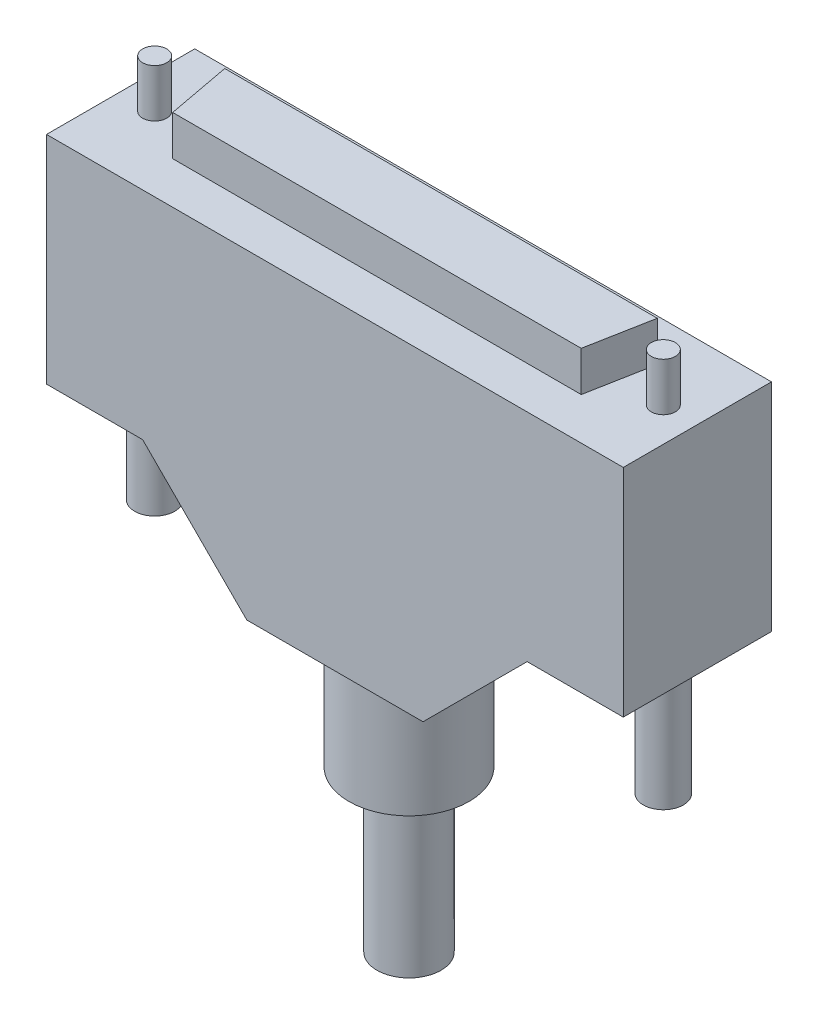
ISO-10303-21;
HEADER;
FILE_DESCRIPTION(('STEP AP214'),'2;1');
FILE_NAME('part.step','',(''),(''),'','','');
FILE_SCHEMA(('AUTOMOTIVE_DESIGN { 1 0 10303 214 1 1 1 1 }'));
ENDSEC;
DATA;
#1=APPLICATION_CONTEXT('core data for automotive mechanical design processes');
#2=APPLICATION_PROTOCOL_DEFINITION('international standard','automotive_design',2000,#1);
#3=PRODUCT_CONTEXT('',#1,'mechanical');
#4=PRODUCT('Part','Part','',(#3));
#5=PRODUCT_RELATED_PRODUCT_CATEGORY('part','',(#4));
#6=PRODUCT_DEFINITION_FORMATION('','',#4);
#7=PRODUCT_DEFINITION_CONTEXT('part definition',#1,'design');
#8=PRODUCT_DEFINITION('design','',#6,#7);
#9=PRODUCT_DEFINITION_SHAPE('','',#8);
#10=(LENGTH_UNIT() NAMED_UNIT(*) SI_UNIT(.MILLI.,.METRE.));
#11=(NAMED_UNIT(*) PLANE_ANGLE_UNIT() SI_UNIT($,.RADIAN.));
#12=(NAMED_UNIT(*) SI_UNIT($,.STERADIAN.) SOLID_ANGLE_UNIT());
#13=UNCERTAINTY_MEASURE_WITH_UNIT(LENGTH_MEASURE(1.E-05),#10,'distance_accuracy_value','');
#14=(GEOMETRIC_REPRESENTATION_CONTEXT(3) GLOBAL_UNCERTAINTY_ASSIGNED_CONTEXT((#13)) GLOBAL_UNIT_ASSIGNED_CONTEXT((#10,
#11,#12)) REPRESENTATION_CONTEXT('',''));
#15=CARTESIAN_POINT('',(0.,0.,0.));
#16=DIRECTION('',(0.,0.,1.));
#17=DIRECTION('',(1.,0.,0.));
#18=AXIS2_PLACEMENT_3D('',#15,#16,#17);
#19=CARTESIAN_POINT('',(36.,0.,9.25));
#20=DIRECTION('',(0.,-1.,0.));
#21=DIRECTION('',(1.,0.,0.));
#22=AXIS2_PLACEMENT_3D('',#19,#20,#21);
#23=PLANE('',#22);
#24=CARTESIAN_POINT('',(-31.75,0.,0.));
#25=DIRECTION('',(0.,-1.,0.));
#26=DIRECTION('',(1.,0.,0.));
#27=AXIS2_PLACEMENT_3D('',#24,#25,#26);
#28=CIRCLE('',#27,1.5);
#29=CARTESIAN_POINT('',(-30.25,0.,0.));
#30=VERTEX_POINT('',#29);
#31=EDGE_CURVE('E40',#30,#30,#28,.F.);
#32=ORIENTED_EDGE('',*,*,#31,.F.);
#33=EDGE_LOOP('',(#32));
#34=FACE_BOUND('',#33,.T.);
#35=DIRECTION('',(-1.,0.,0.));
#36=VECTOR('',#35,1.);
#37=CARTESIAN_POINT('',(36.,0.,-9.25));
#38=LINE('',#37,#36);
#39=CARTESIAN_POINT('',(36.,0.,-9.25));
#40=VERTEX_POINT('',#39);
#41=CARTESIAN_POINT('',(-36.,0.,-9.25));
#42=VERTEX_POINT('',#41);
#43=EDGE_CURVE('E167',#40,#42,#38,.T.);
#44=ORIENTED_EDGE('',*,*,#43,.T.);
#45=DIRECTION('',(0.,0.,-1.));
#46=VECTOR('',#45,1.);
#47=CARTESIAN_POINT('',(-36.,0.,9.25));
#48=LINE('',#47,#46);
#49=CARTESIAN_POINT('',(-36.,0.,9.25));
#50=VERTEX_POINT('',#49);
#51=EDGE_CURVE('E181',#50,#42,#48,.T.);
#52=ORIENTED_EDGE('',*,*,#51,.F.);
#53=DIRECTION('',(-1.,0.,0.));
#54=VECTOR('',#53,1.);
#55=CARTESIAN_POINT('',(36.,0.,9.25));
#56=LINE('',#55,#54);
#57=CARTESIAN_POINT('',(36.,0.,9.25));
#58=VERTEX_POINT('',#57);
#59=EDGE_CURVE('E179',#58,#50,#56,.T.);
#60=ORIENTED_EDGE('',*,*,#59,.F.);
#61=DIRECTION('',(0.,0.,-1.));
#62=VECTOR('',#61,1.);
#63=CARTESIAN_POINT('',(36.,0.,9.25));
#64=LINE('',#63,#62);
#65=EDGE_CURVE('E199',#58,#40,#64,.T.);
#66=ORIENTED_EDGE('',*,*,#65,.T.);
#67=EDGE_LOOP('',(#44,#52,#60,#66));
#68=FACE_BOUND('',#67,.T.);
#69=DIRECTION('',(0.184288535050185,0.,0.982872186934322));
#70=VECTOR('',#69,1.);
#71=CARTESIAN_POINT('',(-25.5,0.,4.00000000000001));
#72=LINE('',#71,#70);
#73=CARTESIAN_POINT('',(-27.,0.,-4.00000000000001));
#74=VERTEX_POINT('',#73);
#75=CARTESIAN_POINT('',(-25.5,0.,4.00000000000001));
#76=VERTEX_POINT('',#75);
#77=EDGE_CURVE('E141',#74,#76,#72,.T.);
#78=ORIENTED_EDGE('',*,*,#77,.F.);
#79=DIRECTION('',(-1.,0.,0.));
#80=VECTOR('',#79,1.);
#81=CARTESIAN_POINT('',(-27.,0.,-4.00000000000001));
#82=LINE('',#81,#80);
#83=CARTESIAN_POINT('',(27.,0.,-4.00000000000001));
#84=VERTEX_POINT('',#83);
#85=EDGE_CURVE('E138',#84,#74,#82,.T.);
#86=ORIENTED_EDGE('',*,*,#85,.F.);
#87=DIRECTION('',(0.184288535050185,0.,-0.982872186934322));
#88=VECTOR('',#87,1.);
#89=CARTESIAN_POINT('',(27.,0.,-4.00000000000001));
#90=LINE('',#89,#88);
#91=CARTESIAN_POINT('',(25.5,0.,4.00000000000001));
#92=VERTEX_POINT('',#91);
#93=EDGE_CURVE('E52',#92,#84,#90,.T.);
#94=ORIENTED_EDGE('',*,*,#93,.F.);
#95=DIRECTION('',(1.,0.,0.));
#96=VECTOR('',#95,1.);
#97=CARTESIAN_POINT('',(25.5,0.,4.00000000000001));
#98=LINE('',#97,#96);
#99=EDGE_CURVE('E47',#76,#92,#98,.T.);
#100=ORIENTED_EDGE('',*,*,#99,.F.);
#101=EDGE_LOOP('',(#78,#86,#94,#100));
#102=FACE_BOUND('',#101,.T.);
#103=CARTESIAN_POINT('',(31.75,0.,0.));
#104=DIRECTION('',(0.,-1.,0.));
#105=DIRECTION('',(1.,0.,0.));
#106=AXIS2_PLACEMENT_3D('',#103,#104,#105);
#107=CIRCLE('',#106,1.5);
#108=CARTESIAN_POINT('',(33.25,0.,0.));
#109=VERTEX_POINT('',#108);
#110=EDGE_CURVE('E11',#109,#109,#107,.F.);
#111=ORIENTED_EDGE('',*,*,#110,.F.);
#112=EDGE_LOOP('',(#111));
#113=FACE_BOUND('',#112,.T.);
#114=ADVANCED_FACE('F32',(#34,#68,#102,#113),#23,.F.);
#115=CARTESIAN_POINT('',(36.,-27.,9.25));
#116=DIRECTION('',(0.,1.,0.));
#117=DIRECTION('',(-1.,0.,0.));
#118=AXIS2_PLACEMENT_3D('',#115,#116,#117);
#119=PLANE('',#118);
#120=DIRECTION('',(1.,0.,0.));
#121=VECTOR('',#120,1.);
#122=CARTESIAN_POINT('',(36.,-27.,-9.25));
#123=LINE('',#122,#121);
#124=CARTESIAN_POINT('',(24.,-27.,-9.25));
#125=VERTEX_POINT('',#124);
#126=CARTESIAN_POINT('',(36.,-27.,-9.25));
#127=VERTEX_POINT('',#126);
#128=EDGE_CURVE('E192',#125,#127,#123,.T.);
#129=ORIENTED_EDGE('',*,*,#128,.T.);
#130=DIRECTION('',(0.,0.,-1.));
#131=VECTOR('',#130,1.);
#132=CARTESIAN_POINT('',(36.,-27.,9.25));
#133=LINE('',#132,#131);
#134=CARTESIAN_POINT('',(36.,-27.,9.25));
#135=VERTEX_POINT('',#134);
#136=EDGE_CURVE('E202',#135,#127,#133,.T.);
#137=ORIENTED_EDGE('',*,*,#136,.F.);
#138=DIRECTION('',(1.,0.,0.));
#139=VECTOR('',#138,1.);
#140=CARTESIAN_POINT('',(36.,-27.,9.25));
#141=LINE('',#140,#139);
#142=CARTESIAN_POINT('',(24.,-27.,9.25));
#143=VERTEX_POINT('',#142);
#144=EDGE_CURVE('E175',#143,#135,#141,.T.);
#145=ORIENTED_EDGE('',*,*,#144,.F.);
#146=DIRECTION('',(0.,0.,-1.));
#147=VECTOR('',#146,1.);
#148=CARTESIAN_POINT('',(24.,-27.,9.25));
#149=LINE('',#148,#147);
#150=EDGE_CURVE('E205',#143,#125,#149,.T.);
#151=ORIENTED_EDGE('',*,*,#150,.T.);
#152=EDGE_LOOP('',(#129,#137,#145,#151));
#153=FACE_BOUND('',#152,.T.);
#154=CARTESIAN_POINT('',(31.75,-27.,0.));
#155=DIRECTION('',(0.,1.,0.));
#156=DIRECTION('',(-1.,0.,0.));
#157=AXIS2_PLACEMENT_3D('',#154,#155,#156);
#158=CIRCLE('',#157,2.5);
#159=CARTESIAN_POINT('',(29.25,-27.,0.));
#160=VERTEX_POINT('',#159);
#161=EDGE_CURVE('E226',#160,#160,#158,.F.);
#162=ORIENTED_EDGE('',*,*,#161,.F.);
#163=EDGE_LOOP('',(#162));
#164=FACE_BOUND('',#163,.T.);
#165=ADVANCED_FACE('F235',(#153,#164),#119,.F.);
#166=CARTESIAN_POINT('',(-36.,-27.,9.25));
#167=DIRECTION('',(0.,1.,0.));
#168=DIRECTION('',(0.,0.,1.));
#169=AXIS2_PLACEMENT_3D('',#166,#167,#168);
#170=PLANE('',#169);
#171=DIRECTION('',(1.,0.,0.));
#172=VECTOR('',#171,1.);
#173=CARTESIAN_POINT('',(-36.,-27.,-9.25));
#174=LINE('',#173,#172);
#175=CARTESIAN_POINT('',(-36.,-27.,-9.25));
#176=VERTEX_POINT('',#175);
#177=CARTESIAN_POINT('',(-24.,-27.,-9.25));
#178=VERTEX_POINT('',#177);
#179=EDGE_CURVE('E184',#176,#178,#174,.T.);
#180=ORIENTED_EDGE('',*,*,#179,.T.);
#181=DIRECTION('',(0.,0.,-1.));
#182=VECTOR('',#181,1.);
#183=CARTESIAN_POINT('',(-24.,-27.,9.25));
#184=LINE('',#183,#182);
#185=CARTESIAN_POINT('',(-24.,-27.,9.25));
#186=VERTEX_POINT('',#185);
#187=EDGE_CURVE('E214',#186,#178,#184,.T.);
#188=ORIENTED_EDGE('',*,*,#187,.F.);
#189=DIRECTION('',(1.,0.,0.));
#190=VECTOR('',#189,1.);
#191=CARTESIAN_POINT('',(-36.,-27.,9.25));
#192=LINE('',#191,#190);
#193=CARTESIAN_POINT('',(-36.,-27.,9.25));
#194=VERTEX_POINT('',#193);
#195=EDGE_CURVE('E166',#194,#186,#192,.T.);
#196=ORIENTED_EDGE('',*,*,#195,.F.);
#197=DIRECTION('',(0.,0.,-1.));
#198=VECTOR('',#197,1.);
#199=CARTESIAN_POINT('',(-36.,-27.,9.25));
#200=LINE('',#199,#198);
#201=EDGE_CURVE('E217',#194,#176,#200,.T.);
#202=ORIENTED_EDGE('',*,*,#201,.T.);
#203=EDGE_LOOP('',(#180,#188,#196,#202));
#204=FACE_BOUND('',#203,.T.);
#205=CARTESIAN_POINT('',(-31.75,-27.,0.));
#206=DIRECTION('',(0.,1.,0.));
#207=DIRECTION('',(0.,0.,1.));
#208=AXIS2_PLACEMENT_3D('',#205,#206,#207);
#209=CIRCLE('',#208,2.5);
#210=CARTESIAN_POINT('',(-31.75,-27.,2.49999999999999));
#211=VERTEX_POINT('',#210);
#212=EDGE_CURVE('E223',#211,#211,#209,.F.);
#213=ORIENTED_EDGE('',*,*,#212,.F.);
#214=EDGE_LOOP('',(#213));
#215=FACE_BOUND('',#214,.T.);
#216=ADVANCED_FACE('F305',(#204,#215),#170,.F.);
#217=CARTESIAN_POINT('',(0.,-55.,0.));
#218=DIRECTION('',(0.,-1.,0.));
#219=DIRECTION('',(0.,0.,-1.));
#220=AXIS2_PLACEMENT_3D('',#217,#218,#219);
#221=PLANE('',#220);
#222=CARTESIAN_POINT('',(0.,-55.,0.));
#223=DIRECTION('',(0.,-1.,0.));
#224=DIRECTION('',(0.,0.,-1.));
#225=AXIS2_PLACEMENT_3D('',#222,#223,#224);
#226=CIRCLE('',#225,7.5);
#227=CARTESIAN_POINT('',(0.,-55.,-7.5));
#228=VERTEX_POINT('',#227);
#229=EDGE_CURVE('E157',#228,#228,#226,.T.);
#230=ORIENTED_EDGE('',*,*,#229,.T.);
#231=EDGE_LOOP('',(#230));
#232=FACE_BOUND('',#231,.T.);
#233=CARTESIAN_POINT('',(0.,-55.,0.));
#234=DIRECTION('',(0.,-1.,0.));
#235=DIRECTION('',(0.,0.,-1.));
#236=AXIS2_PLACEMENT_3D('',#233,#234,#235);
#237=CIRCLE('',#236,4.);
#238=CARTESIAN_POINT('',(0.,-55.,-4.));
#239=VERTEX_POINT('',#238);
#240=EDGE_CURVE('E153',#239,#239,#237,.T.);
#241=ORIENTED_EDGE('',*,*,#240,.F.);
#242=EDGE_LOOP('',(#241));
#243=FACE_BOUND('',#242,.T.);
#244=ADVANCED_FACE('F301',(#232,#243),#221,.T.);
#245=CARTESIAN_POINT('',(-11.,-40.,9.25));
#246=DIRECTION('',(0.,1.,0.));
#247=DIRECTION('',(0.,0.,1.));
#248=AXIS2_PLACEMENT_3D('',#245,#246,#247);
#249=PLANE('',#248);
#250=DIRECTION('',(1.,0.,0.));
#251=VECTOR('',#250,1.);
#252=CARTESIAN_POINT('',(-11.,-40.,-9.25));
#253=LINE('',#252,#251);
#254=CARTESIAN_POINT('',(-11.,-40.,-9.25));
#255=VERTEX_POINT('',#254);
#256=CARTESIAN_POINT('',(11.,-40.,-9.25));
#257=VERTEX_POINT('',#256);
#258=EDGE_CURVE('E188',#255,#257,#253,.T.);
#259=ORIENTED_EDGE('',*,*,#258,.T.);
#260=DIRECTION('',(0.,0.,-1.));
#261=VECTOR('',#260,1.);
#262=CARTESIAN_POINT('',(11.,-40.,9.25));
#263=LINE('',#262,#261);
#264=CARTESIAN_POINT('',(11.,-40.,9.25));
#265=VERTEX_POINT('',#264);
#266=EDGE_CURVE('E208',#265,#257,#263,.T.);
#267=ORIENTED_EDGE('',*,*,#266,.F.);
#268=DIRECTION('',(1.,0.,0.));
#269=VECTOR('',#268,1.);
#270=CARTESIAN_POINT('',(-11.,-40.,9.25));
#271=LINE('',#270,#269);
#272=CARTESIAN_POINT('',(-11.,-40.,9.25));
#273=VERTEX_POINT('',#272);
#274=EDGE_CURVE('E171',#273,#265,#271,.T.);
#275=ORIENTED_EDGE('',*,*,#274,.F.);
#276=DIRECTION('',(0.,0.,-1.));
#277=VECTOR('',#276,1.);
#278=CARTESIAN_POINT('',(-11.,-40.,9.25));
#279=LINE('',#278,#277);
#280=EDGE_CURVE('E211',#273,#255,#279,.T.);
#281=ORIENTED_EDGE('',*,*,#280,.T.);
#282=EDGE_LOOP('',(#259,#267,#275,#281));
#283=FACE_BOUND('',#282,.T.);
#284=CARTESIAN_POINT('',(0.,-40.,0.));
#285=DIRECTION('',(0.,1.,0.));
#286=DIRECTION('',(0.,0.,1.));
#287=AXIS2_PLACEMENT_3D('',#284,#285,#286);
#288=CIRCLE('',#287,7.5);
#289=CARTESIAN_POINT('',(0.,-40.,7.5));
#290=VERTEX_POINT('',#289);
#291=EDGE_CURVE('E220',#290,#290,#288,.F.);
#292=ORIENTED_EDGE('',*,*,#291,.F.);
#293=EDGE_LOOP('',(#292));
#294=FACE_BOUND('',#293,.T.);
#295=ADVANCED_FACE('F304',(#283,#294),#249,.F.);
#296=CARTESIAN_POINT('',(-36.,0.,9.25));
#297=DIRECTION('',(1.,0.,0.));
#298=DIRECTION('',(0.,1.,0.));
#299=AXIS2_PLACEMENT_3D('',#296,#297,#298);
#300=PLANE('',#299);
#301=DIRECTION('',(0.,-1.,0.));
#302=VECTOR('',#301,1.);
#303=CARTESIAN_POINT('',(-36.,0.,-9.25));
#304=LINE('',#303,#302);
#305=EDGE_CURVE('E162',#42,#176,#304,.T.);
#306=ORIENTED_EDGE('',*,*,#305,.T.);
#307=ORIENTED_EDGE('',*,*,#201,.F.);
#308=DIRECTION('',(0.,-1.,0.));
#309=VECTOR('',#308,1.);
#310=CARTESIAN_POINT('',(-36.,0.,9.25));
#311=LINE('',#310,#309);
#312=EDGE_CURVE('E163',#50,#194,#311,.T.);
#313=ORIENTED_EDGE('',*,*,#312,.F.);
#314=ORIENTED_EDGE('',*,*,#51,.T.);
#315=EDGE_LOOP('',(#306,#307,#313,#314));
#316=FACE_BOUND('',#315,.T.);
#317=ADVANCED_FACE('F34',(#316),#300,.F.);
#318=CARTESIAN_POINT('',(-24.,-27.,9.25));
#319=DIRECTION('',(0.707106781186547,0.707106781186548,0.));
#320=DIRECTION('',(-0.707106781186548,0.707106781186547,0.));
#321=AXIS2_PLACEMENT_3D('',#318,#319,#320);
#322=PLANE('',#321);
#323=DIRECTION('',(0.707106781186548,-0.707106781186547,0.));
#324=VECTOR('',#323,1.);
#325=CARTESIAN_POINT('',(-24.,-27.,-9.25));
#326=LINE('',#325,#324);
#327=EDGE_CURVE('E186',#178,#255,#326,.T.);
#328=ORIENTED_EDGE('',*,*,#327,.T.);
#329=ORIENTED_EDGE('',*,*,#280,.F.);
#330=DIRECTION('',(0.707106781186548,-0.707106781186547,0.));
#331=VECTOR('',#330,1.);
#332=CARTESIAN_POINT('',(-24.,-27.,9.25));
#333=LINE('',#332,#331);
#334=EDGE_CURVE('E169',#186,#273,#333,.T.);
#335=ORIENTED_EDGE('',*,*,#334,.F.);
#336=ORIENTED_EDGE('',*,*,#187,.T.);
#337=EDGE_LOOP('',(#328,#329,#335,#336));
#338=FACE_BOUND('',#337,.T.);
#339=ADVANCED_FACE('F328',(#338),#322,.F.);
#340=CARTESIAN_POINT('',(24.,-27.,9.25));
#341=DIRECTION('',(-0.707106781186547,0.707106781186547,0.));
#342=DIRECTION('',(-0.707106781186548,-0.707106781186548,0.));
#343=AXIS2_PLACEMENT_3D('',#340,#341,#342);
#344=PLANE('',#343);
#345=DIRECTION('',(0.707106781186547,0.707106781186547,0.));
#346=VECTOR('',#345,1.);
#347=CARTESIAN_POINT('',(24.,-27.,-9.25));
#348=LINE('',#347,#346);
#349=EDGE_CURVE('E190',#257,#125,#348,.T.);
#350=ORIENTED_EDGE('',*,*,#349,.T.);
#351=ORIENTED_EDGE('',*,*,#150,.F.);
#352=DIRECTION('',(0.707106781186547,0.707106781186547,0.));
#353=VECTOR('',#352,1.);
#354=CARTESIAN_POINT('',(24.,-27.,9.25));
#355=LINE('',#354,#353);
#356=EDGE_CURVE('E173',#265,#143,#355,.T.);
#357=ORIENTED_EDGE('',*,*,#356,.F.);
#358=ORIENTED_EDGE('',*,*,#266,.T.);
#359=EDGE_LOOP('',(#350,#351,#357,#358));
#360=FACE_BOUND('',#359,.T.);
#361=ADVANCED_FACE('F321',(#360),#344,.F.);
#362=CARTESIAN_POINT('',(36.,0.,9.25));
#363=DIRECTION('',(-1.,0.,0.));
#364=DIRECTION('',(0.,-1.,0.));
#365=AXIS2_PLACEMENT_3D('',#362,#363,#364);
#366=PLANE('',#365);
#367=DIRECTION('',(0.,1.,0.));
#368=VECTOR('',#367,1.);
#369=CARTESIAN_POINT('',(36.,0.,-9.25));
#370=LINE('',#369,#368);
#371=EDGE_CURVE('E194',#127,#40,#370,.T.);
#372=ORIENTED_EDGE('',*,*,#371,.T.);
#373=ORIENTED_EDGE('',*,*,#65,.F.);
#374=DIRECTION('',(0.,1.,0.));
#375=VECTOR('',#374,1.);
#376=CARTESIAN_POINT('',(36.,0.,9.25));
#377=LINE('',#376,#375);
#378=EDGE_CURVE('E177',#135,#58,#377,.T.);
#379=ORIENTED_EDGE('',*,*,#378,.F.);
#380=ORIENTED_EDGE('',*,*,#136,.T.);
#381=EDGE_LOOP('',(#372,#373,#379,#380));
#382=FACE_BOUND('',#381,.T.);
#383=ADVANCED_FACE('F314',(#382),#366,.F.);
#384=CARTESIAN_POINT('',(-36.,-27.,9.25));
#385=DIRECTION('',(0.,0.,1.));
#386=DIRECTION('',(1.,0.,0.));
#387=AXIS2_PLACEMENT_3D('',#384,#385,#386);
#388=PLANE('',#387);
#389=ORIENTED_EDGE('',*,*,#312,.T.);
#390=ORIENTED_EDGE('',*,*,#195,.T.);
#391=ORIENTED_EDGE('',*,*,#334,.T.);
#392=ORIENTED_EDGE('',*,*,#274,.T.);
#393=ORIENTED_EDGE('',*,*,#356,.T.);
#394=ORIENTED_EDGE('',*,*,#144,.T.);
#395=ORIENTED_EDGE('',*,*,#378,.T.);
#396=ORIENTED_EDGE('',*,*,#59,.T.);
#397=EDGE_LOOP('',(#389,#390,#391,#392,#393,#394,#395,#396));
#398=FACE_BOUND('',#397,.T.);
#399=ADVANCED_FACE('F311',(#398),#388,.T.);
#400=CARTESIAN_POINT('',(-36.,-27.,-9.25));
#401=DIRECTION('',(0.,0.,1.));
#402=DIRECTION('',(1.,0.,0.));
#403=AXIS2_PLACEMENT_3D('',#400,#401,#402);
#404=PLANE('',#403);
#405=ORIENTED_EDGE('',*,*,#305,.F.);
#406=ORIENTED_EDGE('',*,*,#43,.F.);
#407=ORIENTED_EDGE('',*,*,#371,.F.);
#408=ORIENTED_EDGE('',*,*,#128,.F.);
#409=ORIENTED_EDGE('',*,*,#349,.F.);
#410=ORIENTED_EDGE('',*,*,#258,.F.);
#411=ORIENTED_EDGE('',*,*,#327,.F.);
#412=ORIENTED_EDGE('',*,*,#179,.F.);
#413=EDGE_LOOP('',(#405,#406,#407,#408,#409,#410,#411,#412));
#414=FACE_BOUND('',#413,.T.);
#415=ADVANCED_FACE('F309',(#414),#404,.F.);
#416=CARTESIAN_POINT('',(0.,-55.,0.));
#417=DIRECTION('',(0.,1.,0.));
#418=DIRECTION('',(0.,0.,1.));
#419=AXIS2_PLACEMENT_3D('',#416,#417,#418);
#420=CYLINDRICAL_SURFACE('',#419,7.5);
#421=ORIENTED_EDGE('',*,*,#229,.F.);
#422=EDGE_LOOP('',(#421));
#423=FACE_BOUND('',#422,.T.);
#424=ORIENTED_EDGE('',*,*,#291,.T.);
#425=EDGE_LOOP('',(#424));
#426=FACE_BOUND('',#425,.T.);
#427=ADVANCED_FACE('F299',(#423,#426),#420,.T.);
#428=CARTESIAN_POINT('',(0.,-75.,0.));
#429=DIRECTION('',(0.,1.,0.));
#430=DIRECTION('',(0.,0.,1.));
#431=AXIS2_PLACEMENT_3D('',#428,#429,#430);
#432=CYLINDRICAL_SURFACE('',#431,4.);
#433=CARTESIAN_POINT('',(0.,-75.,0.));
#434=DIRECTION('',(0.,-1.,0.));
#435=DIRECTION('',(0.,0.,-1.));
#436=AXIS2_PLACEMENT_3D('',#433,#434,#435);
#437=CIRCLE('',#436,4.);
#438=CARTESIAN_POINT('',(0.,-75.,-4.));
#439=VERTEX_POINT('',#438);
#440=EDGE_CURVE('E154',#439,#439,#437,.T.);
#441=ORIENTED_EDGE('',*,*,#440,.F.);
#442=EDGE_LOOP('',(#441));
#443=FACE_BOUND('',#442,.T.);
#444=ORIENTED_EDGE('',*,*,#240,.T.);
#445=EDGE_LOOP('',(#444));
#446=FACE_BOUND('',#445,.T.);
#447=ADVANCED_FACE('F295',(#443,#446),#432,.T.);
#448=CARTESIAN_POINT('',(0.,-75.,0.));
#449=DIRECTION('',(0.,-1.,0.));
#450=DIRECTION('',(0.,0.,-1.));
#451=AXIS2_PLACEMENT_3D('',#448,#449,#450);
#452=PLANE('',#451);
#453=ORIENTED_EDGE('',*,*,#440,.T.);
#454=EDGE_LOOP('',(#453));
#455=FACE_BOUND('',#454,.T.);
#456=ADVANCED_FACE('F291',(#455),#452,.T.);
#457=CARTESIAN_POINT('',(-31.75,-42.,0.));
#458=DIRECTION('',(0.,1.,0.));
#459=DIRECTION('',(0.,0.,1.));
#460=AXIS2_PLACEMENT_3D('',#457,#458,#459);
#461=CYLINDRICAL_SURFACE('',#460,2.5);
#462=CARTESIAN_POINT('',(-31.75,-42.,0.));
#463=DIRECTION('',(0.,-1.,0.));
#464=DIRECTION('',(0.,0.,-1.));
#465=AXIS2_PLACEMENT_3D('',#462,#463,#464);
#466=CIRCLE('',#465,2.5);
#467=CARTESIAN_POINT('',(-31.75,-42.,-2.5));
#468=VERTEX_POINT('',#467);
#469=EDGE_CURVE('E145',#468,#468,#466,.T.);
#470=ORIENTED_EDGE('',*,*,#469,.F.);
#471=EDGE_LOOP('',(#470));
#472=FACE_BOUND('',#471,.T.);
#473=ORIENTED_EDGE('',*,*,#212,.T.);
#474=EDGE_LOOP('',(#473));
#475=FACE_BOUND('',#474,.T.);
#476=ADVANCED_FACE('F287',(#472,#475),#461,.T.);
#477=CARTESIAN_POINT('',(-31.75,-42.,0.));
#478=DIRECTION('',(0.,-1.,0.));
#479=DIRECTION('',(0.,0.,-1.));
#480=AXIS2_PLACEMENT_3D('',#477,#478,#479);
#481=PLANE('',#480);
#482=ORIENTED_EDGE('',*,*,#469,.T.);
#483=EDGE_LOOP('',(#482));
#484=FACE_BOUND('',#483,.T.);
#485=ADVANCED_FACE('F283',(#484),#481,.T.);
#486=CARTESIAN_POINT('',(31.75,-42.,0.));
#487=DIRECTION('',(0.,1.,0.));
#488=DIRECTION('',(0.,0.,1.));
#489=AXIS2_PLACEMENT_3D('',#486,#487,#488);
#490=CYLINDRICAL_SURFACE('',#489,2.5);
#491=CARTESIAN_POINT('',(31.75,-42.,0.));
#492=DIRECTION('',(0.,-1.,0.));
#493=DIRECTION('',(0.,0.,1.));
#494=AXIS2_PLACEMENT_3D('',#491,#492,#493);
#495=CIRCLE('',#494,2.5);
#496=CARTESIAN_POINT('',(31.75,-42.,2.5));
#497=VERTEX_POINT('',#496);
#498=EDGE_CURVE('E142',#497,#497,#495,.T.);
#499=ORIENTED_EDGE('',*,*,#498,.F.);
#500=EDGE_LOOP('',(#499));
#501=FACE_BOUND('',#500,.T.);
#502=ORIENTED_EDGE('',*,*,#161,.T.);
#503=EDGE_LOOP('',(#502));
#504=FACE_BOUND('',#503,.T.);
#505=ADVANCED_FACE('F279',(#501,#504),#490,.T.);
#506=CARTESIAN_POINT('',(31.75,-42.,0.));
#507=DIRECTION('',(0.,1.,0.));
#508=DIRECTION('',(0.,0.,1.));
#509=AXIS2_PLACEMENT_3D('',#506,#507,#508);
#510=PLANE('',#509);
#511=ORIENTED_EDGE('',*,*,#498,.T.);
#512=EDGE_LOOP('',(#511));
#513=FACE_BOUND('',#512,.T.);
#514=ADVANCED_FACE('F276',(#513),#510,.F.);
#515=CARTESIAN_POINT('',(-25.5,5.,4.00000000000001));
#516=DIRECTION('',(0.982872186934322,0.,-0.184288535050185));
#517=DIRECTION('',(-0.184288535050185,0.,-0.982872186934322));
#518=AXIS2_PLACEMENT_3D('',#515,#516,#517);
#519=PLANE('',#518);
#520=ORIENTED_EDGE('',*,*,#77,.T.);
#521=DIRECTION('',(0.,-1.,0.));
#522=VECTOR('',#521,1.);
#523=CARTESIAN_POINT('',(-25.5,5.,4.00000000000001));
#524=LINE('',#523,#522);
#525=CARTESIAN_POINT('',(-25.5,5.,4.00000000000001));
#526=VERTEX_POINT('',#525);
#527=EDGE_CURVE('E122',#526,#76,#524,.T.);
#528=ORIENTED_EDGE('',*,*,#527,.F.);
#529=DIRECTION('',(0.184288535050185,0.,0.982872186934322));
#530=VECTOR('',#529,1.);
#531=CARTESIAN_POINT('',(-25.5,5.,4.00000000000001));
#532=LINE('',#531,#530);
#533=CARTESIAN_POINT('',(-27.,5.,-4.00000000000001));
#534=VERTEX_POINT('',#533);
#535=EDGE_CURVE('E129',#534,#526,#532,.T.);
#536=ORIENTED_EDGE('',*,*,#535,.F.);
#537=DIRECTION('',(0.,-1.,0.));
#538=VECTOR('',#537,1.);
#539=CARTESIAN_POINT('',(-27.,5.,-4.00000000000001));
#540=LINE('',#539,#538);
#541=EDGE_CURVE('E538',#534,#74,#540,.T.);
#542=ORIENTED_EDGE('',*,*,#541,.T.);
#543=EDGE_LOOP('',(#520,#528,#536,#542));
#544=FACE_BOUND('',#543,.T.);
#545=ADVANCED_FACE('F140',(#544),#519,.F.);
#546=CARTESIAN_POINT('',(25.5,5.,4.00000000000001));
#547=DIRECTION('',(0.,0.,-1.));
#548=DIRECTION('',(-1.,0.,0.));
#549=AXIS2_PLACEMENT_3D('',#546,#547,#548);
#550=PLANE('',#549);
#551=ORIENTED_EDGE('',*,*,#99,.T.);
#552=DIRECTION('',(0.,-1.,0.));
#553=VECTOR('',#552,1.);
#554=CARTESIAN_POINT('',(25.5,5.,4.00000000000001));
#555=LINE('',#554,#553);
#556=CARTESIAN_POINT('',(25.5,5.,4.00000000000001));
#557=VERTEX_POINT('',#556);
#558=EDGE_CURVE('E125',#557,#92,#555,.T.);
#559=ORIENTED_EDGE('',*,*,#558,.F.);
#560=DIRECTION('',(1.,0.,0.));
#561=VECTOR('',#560,1.);
#562=CARTESIAN_POINT('',(25.5,5.,4.00000000000001));
#563=LINE('',#562,#561);
#564=EDGE_CURVE('E118',#526,#557,#563,.T.);
#565=ORIENTED_EDGE('',*,*,#564,.F.);
#566=ORIENTED_EDGE('',*,*,#527,.T.);
#567=EDGE_LOOP('',(#551,#559,#565,#566));
#568=FACE_BOUND('',#567,.T.);
#569=ADVANCED_FACE('F120',(#568),#550,.F.);
#570=CARTESIAN_POINT('',(27.,5.,-4.00000000000001));
#571=DIRECTION('',(-0.982872186934322,0.,-0.184288535050185));
#572=DIRECTION('',(-0.184288535050185,0.,0.982872186934322));
#573=AXIS2_PLACEMENT_3D('',#570,#571,#572);
#574=PLANE('',#573);
#575=ORIENTED_EDGE('',*,*,#93,.T.);
#576=DIRECTION('',(0.,-1.,0.));
#577=VECTOR('',#576,1.);
#578=CARTESIAN_POINT('',(27.,5.,-4.00000000000001));
#579=LINE('',#578,#577);
#580=CARTESIAN_POINT('',(27.,5.,-4.00000000000001));
#581=VERTEX_POINT('',#580);
#582=EDGE_CURVE('E147',#581,#84,#579,.T.);
#583=ORIENTED_EDGE('',*,*,#582,.F.);
#584=DIRECTION('',(0.184288535050185,0.,-0.982872186934322));
#585=VECTOR('',#584,1.);
#586=CARTESIAN_POINT('',(27.,5.,-4.00000000000001));
#587=LINE('',#586,#585);
#588=EDGE_CURVE('E128',#557,#581,#587,.T.);
#589=ORIENTED_EDGE('',*,*,#588,.F.);
#590=ORIENTED_EDGE('',*,*,#558,.T.);
#591=EDGE_LOOP('',(#575,#583,#589,#590));
#592=FACE_BOUND('',#591,.T.);
#593=ADVANCED_FACE('F267',(#592),#574,.F.);
#594=CARTESIAN_POINT('',(-27.,5.,-4.00000000000001));
#595=DIRECTION('',(0.,0.,1.));
#596=DIRECTION('',(1.,0.,0.));
#597=AXIS2_PLACEMENT_3D('',#594,#595,#596);
#598=PLANE('',#597);
#599=ORIENTED_EDGE('',*,*,#85,.T.);
#600=ORIENTED_EDGE('',*,*,#541,.F.);
#601=DIRECTION('',(-1.,0.,0.));
#602=VECTOR('',#601,1.);
#603=CARTESIAN_POINT('',(-27.,5.,-4.00000000000001));
#604=LINE('',#603,#602);
#605=EDGE_CURVE('E134',#581,#534,#604,.T.);
#606=ORIENTED_EDGE('',*,*,#605,.F.);
#607=ORIENTED_EDGE('',*,*,#582,.T.);
#608=EDGE_LOOP('',(#599,#600,#606,#607));
#609=FACE_BOUND('',#608,.T.);
#610=ADVANCED_FACE('F264',(#609),#598,.F.);
#611=CARTESIAN_POINT('',(-27.,5.,-4.00000000000001));
#612=DIRECTION('',(0.,-1.,0.));
#613=DIRECTION('',(1.,0.,0.));
#614=AXIS2_PLACEMENT_3D('',#611,#612,#613);
#615=PLANE('',#614);
#616=ORIENTED_EDGE('',*,*,#535,.T.);
#617=ORIENTED_EDGE('',*,*,#564,.T.);
#618=ORIENTED_EDGE('',*,*,#588,.T.);
#619=ORIENTED_EDGE('',*,*,#605,.T.);
#620=EDGE_LOOP('',(#616,#617,#618,#619));
#621=FACE_BOUND('',#620,.T.);
#622=ADVANCED_FACE('F132',(#621),#615,.F.);
#623=CARTESIAN_POINT('',(-31.75,6.,0.));
#624=DIRECTION('',(0.,-1.,0.));
#625=DIRECTION('',(1.,0.,0.));
#626=AXIS2_PLACEMENT_3D('',#623,#624,#625);
#627=CYLINDRICAL_SURFACE('',#626,1.5);
#628=CARTESIAN_POINT('',(-31.75,6.,0.));
#629=DIRECTION('',(0.,1.,0.));
#630=DIRECTION('',(-1.,0.,0.));
#631=AXIS2_PLACEMENT_3D('',#628,#629,#630);
#632=CIRCLE('',#631,1.5);
#633=CARTESIAN_POINT('',(-33.25,6.,0.));
#634=VERTEX_POINT('',#633);
#635=EDGE_CURVE('E544',#634,#634,#632,.T.);
#636=ORIENTED_EDGE('',*,*,#635,.F.);
#637=EDGE_LOOP('',(#636));
#638=FACE_BOUND('',#637,.T.);
#639=ORIENTED_EDGE('',*,*,#31,.T.);
#640=EDGE_LOOP('',(#639));
#641=FACE_BOUND('',#640,.T.);
#642=ADVANCED_FACE('F231',(#638,#641),#627,.T.);
#643=CARTESIAN_POINT('',(-31.75,6.,0.));
#644=DIRECTION('',(0.,1.,0.));
#645=DIRECTION('',(-1.,0.,0.));
#646=AXIS2_PLACEMENT_3D('',#643,#644,#645);
#647=PLANE('',#646);
#648=ORIENTED_EDGE('',*,*,#635,.T.);
#649=EDGE_LOOP('',(#648));
#650=FACE_BOUND('',#649,.T.);
#651=ADVANCED_FACE('F246',(#650),#647,.T.);
#652=CARTESIAN_POINT('',(31.75,6.,0.));
#653=DIRECTION('',(0.,-1.,0.));
#654=DIRECTION('',(1.,0.,0.));
#655=AXIS2_PLACEMENT_3D('',#652,#653,#654);
#656=CYLINDRICAL_SURFACE('',#655,1.5);
#657=CARTESIAN_POINT('',(31.75,6.,0.));
#658=DIRECTION('',(0.,1.,0.));
#659=DIRECTION('',(1.,0.,0.));
#660=AXIS2_PLACEMENT_3D('',#657,#658,#659);
#661=CIRCLE('',#660,1.5);
#662=CARTESIAN_POINT('',(33.25,6.,0.));
#663=VERTEX_POINT('',#662);
#664=EDGE_CURVE('E549',#663,#663,#661,.T.);
#665=ORIENTED_EDGE('',*,*,#664,.F.);
#666=EDGE_LOOP('',(#665));
#667=FACE_BOUND('',#666,.T.);
#668=ORIENTED_EDGE('',*,*,#110,.T.);
#669=EDGE_LOOP('',(#668));
#670=FACE_BOUND('',#669,.T.);
#671=ADVANCED_FACE('F243',(#667,#670),#656,.T.);
#672=CARTESIAN_POINT('',(31.75,6.,0.));
#673=DIRECTION('',(0.,-1.,0.));
#674=DIRECTION('',(1.,0.,0.));
#675=AXIS2_PLACEMENT_3D('',#672,#673,#674);
#676=PLANE('',#675);
#677=ORIENTED_EDGE('',*,*,#664,.T.);
#678=EDGE_LOOP('',(#677));
#679=FACE_BOUND('',#678,.T.);
#680=ADVANCED_FACE('F245',(#679),#676,.F.);
#681=CLOSED_SHELL('',(#114,#165,#216,#244,#295,#317,#339,#361,#383,#399,#415,#427,#447,#456,
#476,#485,#505,#514,#545,#569,#593,#610,#622,#642,#651,#671,#680));
#682=MANIFOLD_SOLID_BREP('B2',#681);
#683=ADVANCED_BREP_SHAPE_REPRESENTATION('',(#18,#682),#14);
#684=SHAPE_DEFINITION_REPRESENTATION(#9,#683);
ENDSEC;
END-ISO-10303-21;
